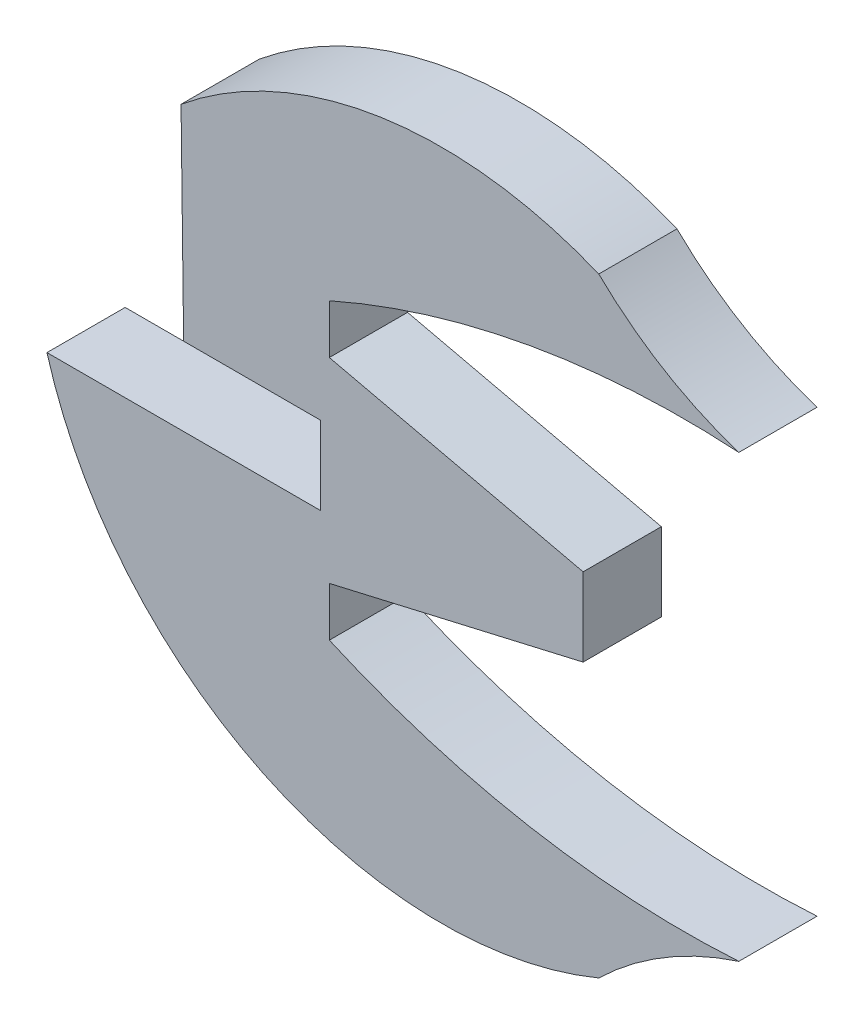
ISO-10303-21;
HEADER;
FILE_DESCRIPTION(('STEP AP214'),'2;1');
FILE_NAME('part.step','',(''),(''),'','','');
FILE_SCHEMA(('AUTOMOTIVE_DESIGN { 1 0 10303 214 1 1 1 1 }'));
ENDSEC;
DATA;
#1=APPLICATION_CONTEXT('core data for automotive mechanical design processes');
#2=APPLICATION_PROTOCOL_DEFINITION('international standard','automotive_design',2000,#1);
#3=PRODUCT_CONTEXT('',#1,'mechanical');
#4=PRODUCT('Part','Part','',(#3));
#5=PRODUCT_RELATED_PRODUCT_CATEGORY('part','',(#4));
#6=PRODUCT_DEFINITION_FORMATION('','',#4);
#7=PRODUCT_DEFINITION_CONTEXT('part definition',#1,'design');
#8=PRODUCT_DEFINITION('design','',#6,#7);
#9=PRODUCT_DEFINITION_SHAPE('','',#8);
#10=(LENGTH_UNIT() NAMED_UNIT(*) SI_UNIT(.MILLI.,.METRE.));
#11=(NAMED_UNIT(*) PLANE_ANGLE_UNIT() SI_UNIT($,.RADIAN.));
#12=(NAMED_UNIT(*) SI_UNIT($,.STERADIAN.) SOLID_ANGLE_UNIT());
#13=UNCERTAINTY_MEASURE_WITH_UNIT(LENGTH_MEASURE(1.E-05),#10,'distance_accuracy_value','');
#14=(GEOMETRIC_REPRESENTATION_CONTEXT(3) GLOBAL_UNCERTAINTY_ASSIGNED_CONTEXT((#13)) GLOBAL_UNIT_ASSIGNED_CONTEXT((#10,
#11,#12)) REPRESENTATION_CONTEXT('',''));
#15=CARTESIAN_POINT('',(0.,0.,0.));
#16=DIRECTION('',(0.,0.,1.));
#17=DIRECTION('',(1.,0.,0.));
#18=AXIS2_PLACEMENT_3D('',#15,#16,#17);
#19=CARTESIAN_POINT('',(41.6848102395139,0.,1.524));
#20=DIRECTION('',(0.,1.,0.));
#21=DIRECTION('',(-1.,0.,0.));
#22=AXIS2_PLACEMENT_3D('',#19,#20,#21);
#23=PLANE('',#22);
#24=DIRECTION('',(1.,0.,0.));
#25=VECTOR('',#24,1.);
#26=CARTESIAN_POINT('',(41.6848102395139,0.,0.));
#27=LINE('',#26,#25);
#28=CARTESIAN_POINT('',(39.0213897386134,0.,0.));
#29=VERTEX_POINT('',#28);
#30=CARTESIAN_POINT('',(41.6848102395139,0.,0.));
#31=VERTEX_POINT('',#30);
#32=EDGE_CURVE('E169',#29,#31,#27,.T.);
#33=ORIENTED_EDGE('',*,*,#32,.T.);
#34=DIRECTION('',(0.,0.,-1.));
#35=VECTOR('',#34,1.);
#36=CARTESIAN_POINT('',(41.6848102395139,0.,1.524));
#37=LINE('',#36,#35);
#38=CARTESIAN_POINT('',(41.6848102395139,0.,1.524));
#39=VERTEX_POINT('',#38);
#40=EDGE_CURVE('E11',#39,#31,#37,.T.);
#41=ORIENTED_EDGE('',*,*,#40,.F.);
#42=DIRECTION('',(1.,0.,0.));
#43=VECTOR('',#42,1.);
#44=CARTESIAN_POINT('',(41.6848102395139,0.,1.524));
#45=LINE('',#44,#43);
#46=CARTESIAN_POINT('',(39.0213897386134,0.,1.524));
#47=VERTEX_POINT('',#46);
#48=EDGE_CURVE('E197',#47,#39,#45,.T.);
#49=ORIENTED_EDGE('',*,*,#48,.F.);
#50=DIRECTION('',(0.,0.,-1.));
#51=VECTOR('',#50,1.);
#52=CARTESIAN_POINT('',(39.0213897386134,0.,1.524));
#53=LINE('',#52,#51);
#54=EDGE_CURVE('E165',#47,#29,#53,.T.);
#55=ORIENTED_EDGE('',*,*,#54,.T.);
#56=EDGE_LOOP('',(#33,#41,#49,#55));
#57=FACE_BOUND('',#56,.T.);
#58=ADVANCED_FACE('F31',(#57),#23,.F.);
#59=CARTESIAN_POINT('',(41.6848102395139,0.,1.524));
#60=DIRECTION('',(1.,0.,0.));
#61=DIRECTION('',(0.,0.,-1.));
#62=AXIS2_PLACEMENT_3D('',#59,#60,#61);
#63=PLANE('',#62);
#64=DIRECTION('',(0.,-1.,0.));
#65=VECTOR('',#64,1.);
#66=CARTESIAN_POINT('',(41.6848102395139,0.,0.));
#67=LINE('',#66,#65);
#68=CARTESIAN_POINT('',(41.6848102395139,-1.524,0.));
#69=VERTEX_POINT('',#68);
#70=EDGE_CURVE('E172',#31,#69,#67,.T.);
#71=ORIENTED_EDGE('',*,*,#70,.T.);
#72=DIRECTION('',(0.,0.,-1.));
#73=VECTOR('',#72,1.);
#74=CARTESIAN_POINT('',(41.6848102395139,-1.524,1.524));
#75=LINE('',#74,#73);
#76=CARTESIAN_POINT('',(41.6848102395139,-1.524,1.524));
#77=VERTEX_POINT('',#76);
#78=EDGE_CURVE('E39',#77,#69,#75,.T.);
#79=ORIENTED_EDGE('',*,*,#78,.F.);
#80=DIRECTION('',(0.,-1.,0.));
#81=VECTOR('',#80,1.);
#82=CARTESIAN_POINT('',(41.6848102395139,0.,1.524));
#83=LINE('',#82,#81);
#84=EDGE_CURVE('E111',#39,#77,#83,.T.);
#85=ORIENTED_EDGE('',*,*,#84,.F.);
#86=ORIENTED_EDGE('',*,*,#40,.T.);
#87=EDGE_LOOP('',(#71,#79,#85,#86));
#88=FACE_BOUND('',#87,.T.);
#89=ADVANCED_FACE('F290',(#88),#63,.F.);
#90=CARTESIAN_POINT('',(41.6848102395139,-1.524,1.524));
#91=DIRECTION('',(0.,-1.,0.));
#92=DIRECTION('',(0.,0.,-1.));
#93=AXIS2_PLACEMENT_3D('',#90,#91,#92);
#94=PLANE('',#93);
#95=DIRECTION('',(-1.,0.,0.));
#96=VECTOR('',#95,1.);
#97=CARTESIAN_POINT('',(41.6848102395139,-1.524,0.));
#98=LINE('',#97,#96);
#99=CARTESIAN_POINT('',(36.357969237713,-1.524,0.));
#100=VERTEX_POINT('',#99);
#101=EDGE_CURVE('E174',#69,#100,#98,.T.);
#102=ORIENTED_EDGE('',*,*,#101,.T.);
#103=DIRECTION('',(0.,0.,-1.));
#104=VECTOR('',#103,1.);
#105=CARTESIAN_POINT('',(36.357969237713,-1.524,1.524));
#106=LINE('',#105,#104);
#107=CARTESIAN_POINT('',(36.357969237713,-1.524,1.524));
#108=VERTEX_POINT('',#107);
#109=EDGE_CURVE('E225',#108,#100,#106,.T.);
#110=ORIENTED_EDGE('',*,*,#109,.F.);
#111=DIRECTION('',(-1.,0.,0.));
#112=VECTOR('',#111,1.);
#113=CARTESIAN_POINT('',(41.6848102395139,-1.524,1.524));
#114=LINE('',#113,#112);
#115=EDGE_CURVE('E233',#77,#108,#114,.T.);
#116=ORIENTED_EDGE('',*,*,#115,.F.);
#117=ORIENTED_EDGE('',*,*,#78,.T.);
#118=EDGE_LOOP('',(#102,#110,#116,#117));
#119=FACE_BOUND('',#118,.T.);
#120=ADVANCED_FACE('F231',(#119),#94,.F.);
#121=CARTESIAN_POINT('',(44.0460277671729,0.686810719156323,1.524));
#122=DIRECTION('',(0.,0.,-1.));
#123=DIRECTION('',(-1.,0.,0.));
#124=AXIS2_PLACEMENT_3D('',#121,#122,#123);
#125=CYLINDRICAL_SURFACE('',#124,7.99962049026944);
#126=CARTESIAN_POINT('',(44.0460277671729,0.686810719156323,0.));
#127=DIRECTION('',(0.,0.,1.));
#128=DIRECTION('',(-1.,0.,0.));
#129=AXIS2_PLACEMENT_3D('',#126,#127,#128);
#130=CIRCLE('',#129,7.99962049026944);
#131=CARTESIAN_POINT('',(47.1111058802478,-6.70231806230959,0.));
#132=VERTEX_POINT('',#131);
#133=EDGE_CURVE('E176',#100,#132,#130,.T.);
#134=ORIENTED_EDGE('',*,*,#133,.T.);
#135=DIRECTION('',(0.,0.,-1.));
#136=VECTOR('',#135,1.);
#137=CARTESIAN_POINT('',(47.1111058802478,-6.70231806230959,1.524));
#138=LINE('',#137,#136);
#139=CARTESIAN_POINT('',(47.1111058802478,-6.70231806230959,1.524));
#140=VERTEX_POINT('',#139);
#141=EDGE_CURVE('E222',#140,#132,#138,.T.);
#142=ORIENTED_EDGE('',*,*,#141,.F.);
#143=CARTESIAN_POINT('',(44.0460277671729,0.686810719156323,1.524));
#144=DIRECTION('',(0.,0.,1.));
#145=DIRECTION('',(-1.,0.,0.));
#146=AXIS2_PLACEMENT_3D('',#143,#144,#145);
#147=CIRCLE('',#146,7.99962049026944);
#148=EDGE_CURVE('E251',#108,#140,#147,.T.);
#149=ORIENTED_EDGE('',*,*,#148,.F.);
#150=ORIENTED_EDGE('',*,*,#109,.T.);
#151=EDGE_LOOP('',(#134,#142,#149,#150));
#152=FACE_BOUND('',#151,.T.);
#153=ADVANCED_FACE('F242',(#152),#125,.T.);
#154=CARTESIAN_POINT('',(52.0028808130916,-11.7290532733377,1.524));
#155=DIRECTION('',(0.,0.,-1.));
#156=DIRECTION('',(-1.,0.,0.));
#157=AXIS2_PLACEMENT_3D('',#154,#155,#156);
#158=CYLINDRICAL_SURFACE('',#157,7.01409501471067);
#159=CARTESIAN_POINT('',(52.0028808130916,-11.7290532733377,0.));
#160=DIRECTION('',(0.,0.,-1.));
#161=DIRECTION('',(1.,0.,0.));
#162=AXIS2_PLACEMENT_3D('',#159,#160,#161);
#163=CIRCLE('',#162,7.01409501471067);
#164=CARTESIAN_POINT('',(49.8407366045512,-5.05652292144987,0.));
#165=VERTEX_POINT('',#164);
#166=EDGE_CURVE('E178',#132,#165,#163,.T.);
#167=ORIENTED_EDGE('',*,*,#166,.T.);
#168=DIRECTION('',(0.,0.,-1.));
#169=VECTOR('',#168,1.);
#170=CARTESIAN_POINT('',(49.8407366045512,-5.05652292144987,1.524));
#171=LINE('',#170,#169);
#172=CARTESIAN_POINT('',(49.8407366045512,-5.05652292144987,1.524));
#173=VERTEX_POINT('',#172);
#174=EDGE_CURVE('E219',#173,#165,#171,.T.);
#175=ORIENTED_EDGE('',*,*,#174,.F.);
#176=CARTESIAN_POINT('',(52.0028808130916,-11.7290532733377,1.524));
#177=DIRECTION('',(0.,0.,-1.));
#178=DIRECTION('',(1.,0.,0.));
#179=AXIS2_PLACEMENT_3D('',#176,#177,#178);
#180=CIRCLE('',#179,7.01409501471067);
#181=EDGE_CURVE('E248',#140,#173,#180,.T.);
#182=ORIENTED_EDGE('',*,*,#181,.F.);
#183=ORIENTED_EDGE('',*,*,#141,.T.);
#184=EDGE_LOOP('',(#167,#175,#182,#183));
#185=FACE_BOUND('',#184,.T.);
#186=ADVANCED_FACE('F246',(#185),#158,.F.);
#187=CARTESIAN_POINT('',(48.7734680539811,11.9651102828948,1.524));
#188=DIRECTION('',(0.,0.,-1.));
#189=DIRECTION('',(-1.,0.,0.));
#190=AXIS2_PLACEMENT_3D('',#187,#188,#189);
#191=CYLINDRICAL_SURFACE('',#190,17.0550596335012);
#192=CARTESIAN_POINT('',(48.7734680539811,11.9651102828948,0.));
#193=DIRECTION('',(0.,0.,-1.));
#194=DIRECTION('',(1.,0.,0.));
#195=AXIS2_PLACEMENT_3D('',#192,#193,#194);
#196=CIRCLE('',#195,17.0550596335012);
#197=CARTESIAN_POINT('',(41.8607593922502,-3.62621801396031,0.));
#198=VERTEX_POINT('',#197);
#199=EDGE_CURVE('E180',#165,#198,#196,.T.);
#200=ORIENTED_EDGE('',*,*,#199,.T.);
#201=DIRECTION('',(0.,0.,-1.));
#202=VECTOR('',#201,1.);
#203=CARTESIAN_POINT('',(41.8607593922502,-3.62621801396031,1.524));
#204=LINE('',#203,#202);
#205=CARTESIAN_POINT('',(41.8607593922502,-3.62621801396031,1.524));
#206=VERTEX_POINT('',#205);
#207=EDGE_CURVE('E216',#206,#198,#204,.T.);
#208=ORIENTED_EDGE('',*,*,#207,.F.);
#209=CARTESIAN_POINT('',(48.7734680539811,11.9651102828948,1.524));
#210=DIRECTION('',(0.,0.,-1.));
#211=DIRECTION('',(1.,0.,0.));
#212=AXIS2_PLACEMENT_3D('',#209,#210,#211);
#213=CIRCLE('',#212,17.0550596335012);
#214=EDGE_CURVE('E250',#173,#206,#213,.T.);
#215=ORIENTED_EDGE('',*,*,#214,.F.);
#216=ORIENTED_EDGE('',*,*,#174,.T.);
#217=EDGE_LOOP('',(#200,#208,#215,#216));
#218=FACE_BOUND('',#217,.T.);
#219=ADVANCED_FACE('F303',(#218),#191,.F.);
#220=CARTESIAN_POINT('',(41.8607593922502,-2.6675803220968,1.524));
#221=DIRECTION('',(-1.,0.,0.));
#222=DIRECTION('',(0.,0.,1.));
#223=AXIS2_PLACEMENT_3D('',#220,#221,#222);
#224=PLANE('',#223);
#225=DIRECTION('',(0.,1.,0.));
#226=VECTOR('',#225,1.);
#227=CARTESIAN_POINT('',(41.8607593922502,-2.6675803220968,0.));
#228=LINE('',#227,#226);
#229=CARTESIAN_POINT('',(41.8607593922502,-2.6675803220968,0.));
#230=VERTEX_POINT('',#229);
#231=EDGE_CURVE('E182',#198,#230,#228,.T.);
#232=ORIENTED_EDGE('',*,*,#231,.T.);
#233=DIRECTION('',(0.,0.,-1.));
#234=VECTOR('',#233,1.);
#235=CARTESIAN_POINT('',(41.8607593922502,-2.6675803220968,1.524));
#236=LINE('',#235,#234);
#237=CARTESIAN_POINT('',(41.8607593922502,-2.6675803220968,1.524));
#238=VERTEX_POINT('',#237);
#239=EDGE_CURVE('E213',#238,#230,#236,.T.);
#240=ORIENTED_EDGE('',*,*,#239,.F.);
#241=DIRECTION('',(0.,1.,0.));
#242=VECTOR('',#241,1.);
#243=CARTESIAN_POINT('',(41.8607593922502,-2.6675803220968,1.524));
#244=LINE('',#243,#242);
#245=EDGE_CURVE('E253',#206,#238,#244,.T.);
#246=ORIENTED_EDGE('',*,*,#245,.F.);
#247=ORIENTED_EDGE('',*,*,#207,.T.);
#248=EDGE_LOOP('',(#232,#240,#246,#247));
#249=FACE_BOUND('',#248,.T.);
#250=ADVANCED_FACE('F306',(#249),#224,.F.);
#251=CARTESIAN_POINT('',(41.8607593922502,-2.6675803220968,1.524));
#252=DIRECTION('',(-0.225294774762645,0.974290646811643,0.));
#253=DIRECTION('',(-0.974290646811643,-0.225294774762645,0.));
#254=AXIS2_PLACEMENT_3D('',#251,#252,#253);
#255=PLANE('',#254);
#256=DIRECTION('',(0.974290646811643,0.225294774762645,0.));
#257=VECTOR('',#256,1.);
#258=CARTESIAN_POINT('',(41.8607593922502,-2.6675803220968,0.));
#259=LINE('',#258,#257);
#260=CARTESIAN_POINT('',(46.806189719565,-1.524,0.));
#261=VERTEX_POINT('',#260);
#262=EDGE_CURVE('E184',#230,#261,#259,.T.);
#263=ORIENTED_EDGE('',*,*,#262,.T.);
#264=DIRECTION('',(0.,0.,-1.));
#265=VECTOR('',#264,1.);
#266=CARTESIAN_POINT('',(46.806189719565,-1.524,1.524));
#267=LINE('',#266,#265);
#268=CARTESIAN_POINT('',(46.806189719565,-1.524,1.524));
#269=VERTEX_POINT('',#268);
#270=EDGE_CURVE('E210',#269,#261,#267,.T.);
#271=ORIENTED_EDGE('',*,*,#270,.F.);
#272=DIRECTION('',(0.974290646811643,0.225294774762645,0.));
#273=VECTOR('',#272,1.);
#274=CARTESIAN_POINT('',(41.8607593922502,-2.6675803220968,1.524));
#275=LINE('',#274,#273);
#276=EDGE_CURVE('E259',#238,#269,#275,.T.);
#277=ORIENTED_EDGE('',*,*,#276,.F.);
#278=ORIENTED_EDGE('',*,*,#239,.T.);
#279=EDGE_LOOP('',(#263,#271,#277,#278));
#280=FACE_BOUND('',#279,.T.);
#281=ADVANCED_FACE('F310',(#280),#255,.F.);
#282=CARTESIAN_POINT('',(46.806189719565,-1.524,1.524));
#283=DIRECTION('',(-1.,0.,0.));
#284=DIRECTION('',(0.,0.,1.));
#285=AXIS2_PLACEMENT_3D('',#282,#283,#284);
#286=PLANE('',#285);
#287=DIRECTION('',(0.,1.,0.));
#288=VECTOR('',#287,1.);
#289=CARTESIAN_POINT('',(46.806189719565,-1.524,0.));
#290=LINE('',#289,#288);
#291=CARTESIAN_POINT('',(46.806189719565,0.,0.));
#292=VERTEX_POINT('',#291);
#293=EDGE_CURVE('E186',#261,#292,#290,.T.);
#294=ORIENTED_EDGE('',*,*,#293,.T.);
#295=DIRECTION('',(0.,0.,-1.));
#296=VECTOR('',#295,1.);
#297=CARTESIAN_POINT('',(46.806189719565,0.,1.524));
#298=LINE('',#297,#296);
#299=CARTESIAN_POINT('',(46.806189719565,0.,1.524));
#300=VERTEX_POINT('',#299);
#301=EDGE_CURVE('E207',#300,#292,#298,.T.);
#302=ORIENTED_EDGE('',*,*,#301,.F.);
#303=DIRECTION('',(0.,1.,0.));
#304=VECTOR('',#303,1.);
#305=CARTESIAN_POINT('',(46.806189719565,-1.524,1.524));
#306=LINE('',#305,#304);
#307=EDGE_CURVE('E261',#269,#300,#306,.T.);
#308=ORIENTED_EDGE('',*,*,#307,.F.);
#309=ORIENTED_EDGE('',*,*,#270,.T.);
#310=EDGE_LOOP('',(#294,#302,#308,#309));
#311=FACE_BOUND('',#310,.T.);
#312=ADVANCED_FACE('F314',(#311),#286,.F.);
#313=CARTESIAN_POINT('',(41.8607593922502,1.14358032209679,1.524));
#314=DIRECTION('',(-0.225294774762645,-0.974290646811643,0.));
#315=DIRECTION('',(0.974290646811643,-0.225294774762645,0.));
#316=AXIS2_PLACEMENT_3D('',#313,#314,#315);
#317=PLANE('',#316);
#318=DIRECTION('',(-0.974290646811643,0.225294774762645,0.));
#319=VECTOR('',#318,1.);
#320=CARTESIAN_POINT('',(41.8607593922502,1.14358032209679,0.));
#321=LINE('',#320,#319);
#322=CARTESIAN_POINT('',(41.8607593922502,1.14358032209679,0.));
#323=VERTEX_POINT('',#322);
#324=EDGE_CURVE('E188',#292,#323,#321,.T.);
#325=ORIENTED_EDGE('',*,*,#324,.T.);
#326=DIRECTION('',(0.,0.,-1.));
#327=VECTOR('',#326,1.);
#328=CARTESIAN_POINT('',(41.8607593922502,1.14358032209679,1.524));
#329=LINE('',#328,#327);
#330=CARTESIAN_POINT('',(41.8607593922502,1.14358032209679,1.524));
#331=VERTEX_POINT('',#330);
#332=EDGE_CURVE('E204',#331,#323,#329,.T.);
#333=ORIENTED_EDGE('',*,*,#332,.F.);
#334=DIRECTION('',(-0.974290646811643,0.225294774762645,0.));
#335=VECTOR('',#334,1.);
#336=CARTESIAN_POINT('',(41.8607593922502,1.14358032209679,1.524));
#337=LINE('',#336,#335);
#338=EDGE_CURVE('E263',#300,#331,#337,.T.);
#339=ORIENTED_EDGE('',*,*,#338,.F.);
#340=ORIENTED_EDGE('',*,*,#301,.T.);
#341=EDGE_LOOP('',(#325,#333,#339,#340));
#342=FACE_BOUND('',#341,.T.);
#343=ADVANCED_FACE('F318',(#342),#317,.F.);
#344=CARTESIAN_POINT('',(41.8607593922502,1.14358032209679,1.524));
#345=DIRECTION('',(-1.,0.,0.));
#346=DIRECTION('',(0.,0.,1.));
#347=AXIS2_PLACEMENT_3D('',#344,#345,#346);
#348=PLANE('',#347);
#349=DIRECTION('',(0.,1.,0.));
#350=VECTOR('',#349,1.);
#351=CARTESIAN_POINT('',(41.8607593922502,1.14358032209679,0.));
#352=LINE('',#351,#350);
#353=CARTESIAN_POINT('',(41.8607593922502,2.1022180139603,0.));
#354=VERTEX_POINT('',#353);
#355=EDGE_CURVE('E190',#323,#354,#352,.T.);
#356=ORIENTED_EDGE('',*,*,#355,.T.);
#357=DIRECTION('',(0.,0.,-1.));
#358=VECTOR('',#357,1.);
#359=CARTESIAN_POINT('',(41.8607593922502,2.1022180139603,1.524));
#360=LINE('',#359,#358);
#361=CARTESIAN_POINT('',(41.8607593922502,2.1022180139603,1.524));
#362=VERTEX_POINT('',#361);
#363=EDGE_CURVE('E201',#362,#354,#360,.T.);
#364=ORIENTED_EDGE('',*,*,#363,.F.);
#365=DIRECTION('',(0.,1.,0.));
#366=VECTOR('',#365,1.);
#367=CARTESIAN_POINT('',(41.8607593922502,1.14358032209679,1.524));
#368=LINE('',#367,#366);
#369=EDGE_CURVE('E265',#331,#362,#368,.T.);
#370=ORIENTED_EDGE('',*,*,#369,.F.);
#371=ORIENTED_EDGE('',*,*,#332,.T.);
#372=EDGE_LOOP('',(#356,#364,#370,#371));
#373=FACE_BOUND('',#372,.T.);
#374=ADVANCED_FACE('F271',(#373),#348,.F.);
#375=CARTESIAN_POINT('',(48.7734680539811,-13.4891102828948,1.524));
#376=DIRECTION('',(0.,0.,-1.));
#377=DIRECTION('',(-1.,0.,0.));
#378=AXIS2_PLACEMENT_3D('',#375,#376,#377);
#379=CYLINDRICAL_SURFACE('',#378,17.0550596335012);
#380=CARTESIAN_POINT('',(48.7734680539811,-13.4891102828948,0.));
#381=DIRECTION('',(0.,0.,-1.));
#382=DIRECTION('',(-1.,0.,0.));
#383=AXIS2_PLACEMENT_3D('',#380,#381,#382);
#384=CIRCLE('',#383,17.0550596335012);
#385=CARTESIAN_POINT('',(49.8407366045512,3.53252292144986,0.));
#386=VERTEX_POINT('',#385);
#387=EDGE_CURVE('E192',#354,#386,#384,.T.);
#388=ORIENTED_EDGE('',*,*,#387,.T.);
#389=DIRECTION('',(0.,0.,-1.));
#390=VECTOR('',#389,1.);
#391=CARTESIAN_POINT('',(49.8407366045512,3.53252292144986,1.524));
#392=LINE('',#391,#390);
#393=CARTESIAN_POINT('',(49.8407366045512,3.53252292144986,1.524));
#394=VERTEX_POINT('',#393);
#395=EDGE_CURVE('E160',#394,#386,#392,.T.);
#396=ORIENTED_EDGE('',*,*,#395,.F.);
#397=CARTESIAN_POINT('',(48.7734680539811,-13.4891102828948,1.524));
#398=DIRECTION('',(0.,0.,-1.));
#399=DIRECTION('',(-1.,0.,0.));
#400=AXIS2_PLACEMENT_3D('',#397,#398,#399);
#401=CIRCLE('',#400,17.0550596335012);
#402=EDGE_CURVE('E151',#362,#394,#401,.T.);
#403=ORIENTED_EDGE('',*,*,#402,.F.);
#404=ORIENTED_EDGE('',*,*,#363,.T.);
#405=EDGE_LOOP('',(#388,#396,#403,#404));
#406=FACE_BOUND('',#405,.T.);
#407=ADVANCED_FACE('F275',(#406),#379,.F.);
#408=CARTESIAN_POINT('',(52.0028808130916,10.2050532733377,1.524));
#409=DIRECTION('',(0.,0.,-1.));
#410=DIRECTION('',(-1.,0.,0.));
#411=AXIS2_PLACEMENT_3D('',#408,#409,#410);
#412=CYLINDRICAL_SURFACE('',#411,7.01409501471067);
#413=CARTESIAN_POINT('',(52.0028808130916,10.2050532733377,0.));
#414=DIRECTION('',(0.,0.,-1.));
#415=DIRECTION('',(-1.,0.,0.));
#416=AXIS2_PLACEMENT_3D('',#413,#414,#415);
#417=CIRCLE('',#416,7.01409501471067);
#418=CARTESIAN_POINT('',(47.1111058802478,5.17831806230958,0.));
#419=VERTEX_POINT('',#418);
#420=EDGE_CURVE('E159',#386,#419,#417,.T.);
#421=ORIENTED_EDGE('',*,*,#420,.T.);
#422=DIRECTION('',(0.,0.,-1.));
#423=VECTOR('',#422,1.);
#424=CARTESIAN_POINT('',(47.1111058802478,5.17831806230958,1.524));
#425=LINE('',#424,#423);
#426=CARTESIAN_POINT('',(47.1111058802478,5.17831806230958,1.524));
#427=VERTEX_POINT('',#426);
#428=EDGE_CURVE('E156',#427,#419,#425,.T.);
#429=ORIENTED_EDGE('',*,*,#428,.F.);
#430=CARTESIAN_POINT('',(52.0028808130916,10.2050532733377,1.524));
#431=DIRECTION('',(0.,0.,-1.));
#432=DIRECTION('',(-1.,0.,0.));
#433=AXIS2_PLACEMENT_3D('',#430,#431,#432);
#434=CIRCLE('',#433,7.01409501471067);
#435=EDGE_CURVE('E145',#394,#427,#434,.T.);
#436=ORIENTED_EDGE('',*,*,#435,.F.);
#437=ORIENTED_EDGE('',*,*,#395,.T.);
#438=EDGE_LOOP('',(#421,#429,#436,#437));
#439=FACE_BOUND('',#438,.T.);
#440=ADVANCED_FACE('F157',(#439),#412,.F.);
#441=CARTESIAN_POINT('',(44.0460277671729,-2.21081071915633,1.524));
#442=DIRECTION('',(0.,0.,-1.));
#443=DIRECTION('',(-1.,0.,0.));
#444=AXIS2_PLACEMENT_3D('',#441,#442,#443);
#445=CYLINDRICAL_SURFACE('',#444,7.99962049026944);
#446=CARTESIAN_POINT('',(44.0460277671729,-2.21081071915633,0.));
#447=DIRECTION('',(0.,0.,1.));
#448=DIRECTION('',(1.,0.,0.));
#449=AXIS2_PLACEMENT_3D('',#446,#447,#448);
#450=CIRCLE('',#449,7.99962049026944);
#451=CARTESIAN_POINT('',(38.9710853298873,3.97294924114096,0.));
#452=VERTEX_POINT('',#451);
#453=EDGE_CURVE('E97',#419,#452,#450,.T.);
#454=ORIENTED_EDGE('',*,*,#453,.T.);
#455=DIRECTION('',(0.,0.,-1.));
#456=VECTOR('',#455,1.);
#457=CARTESIAN_POINT('',(38.9710853298873,3.97294924114096,1.524));
#458=LINE('',#457,#456);
#459=CARTESIAN_POINT('',(38.9710853298873,3.97294924114096,1.524));
#460=VERTEX_POINT('',#459);
#461=EDGE_CURVE('E161',#460,#452,#458,.T.);
#462=ORIENTED_EDGE('',*,*,#461,.F.);
#463=CARTESIAN_POINT('',(44.0460277671729,-2.21081071915633,1.524));
#464=DIRECTION('',(0.,0.,1.));
#465=DIRECTION('',(1.,0.,0.));
#466=AXIS2_PLACEMENT_3D('',#463,#464,#465);
#467=CIRCLE('',#466,7.99962049026944);
#468=EDGE_CURVE('E149',#427,#460,#467,.T.);
#469=ORIENTED_EDGE('',*,*,#468,.F.);
#470=ORIENTED_EDGE('',*,*,#428,.T.);
#471=EDGE_LOOP('',(#454,#462,#469,#470));
#472=FACE_BOUND('',#471,.T.);
#473=ADVANCED_FACE('F163',(#472),#445,.T.);
#474=CARTESIAN_POINT('',(38.9710853298873,3.97294924114096,1.524));
#475=DIRECTION('',(0.999919849939738,0.0126607146912156,0.));
#476=DIRECTION('',(-0.0126607146912156,0.999919849939738,0.));
#477=AXIS2_PLACEMENT_3D('',#474,#475,#476);
#478=PLANE('',#477);
#479=DIRECTION('',(0.0126607146912156,-0.999919849939738,0.));
#480=VECTOR('',#479,1.);
#481=CARTESIAN_POINT('',(38.9710853298873,3.97294924114096,0.));
#482=LINE('',#481,#480);
#483=EDGE_CURVE('E103',#452,#29,#482,.T.);
#484=ORIENTED_EDGE('',*,*,#483,.T.);
#485=ORIENTED_EDGE('',*,*,#54,.F.);
#486=DIRECTION('',(0.0126607146912156,-0.999919849939738,0.));
#487=VECTOR('',#486,1.);
#488=CARTESIAN_POINT('',(38.9710853298873,3.97294924114096,1.524));
#489=LINE('',#488,#487);
#490=EDGE_CURVE('E47',#460,#47,#489,.T.);
#491=ORIENTED_EDGE('',*,*,#490,.F.);
#492=ORIENTED_EDGE('',*,*,#461,.T.);
#493=EDGE_LOOP('',(#484,#485,#491,#492));
#494=FACE_BOUND('',#493,.T.);
#495=ADVANCED_FACE('F279',(#494),#478,.F.);
#496=CARTESIAN_POINT('',(44.0460277671729,-2.21081071915633,1.524));
#497=DIRECTION('',(0.,0.,1.));
#498=DIRECTION('',(1.,0.,0.));
#499=AXIS2_PLACEMENT_3D('',#496,#497,#498);
#500=PLANE('',#499);
#501=ORIENTED_EDGE('',*,*,#48,.T.);
#502=ORIENTED_EDGE('',*,*,#84,.T.);
#503=ORIENTED_EDGE('',*,*,#115,.T.);
#504=ORIENTED_EDGE('',*,*,#148,.T.);
#505=ORIENTED_EDGE('',*,*,#181,.T.);
#506=ORIENTED_EDGE('',*,*,#214,.T.);
#507=ORIENTED_EDGE('',*,*,#245,.T.);
#508=ORIENTED_EDGE('',*,*,#276,.T.);
#509=ORIENTED_EDGE('',*,*,#307,.T.);
#510=ORIENTED_EDGE('',*,*,#338,.T.);
#511=ORIENTED_EDGE('',*,*,#369,.T.);
#512=ORIENTED_EDGE('',*,*,#402,.T.);
#513=ORIENTED_EDGE('',*,*,#435,.T.);
#514=ORIENTED_EDGE('',*,*,#468,.T.);
#515=ORIENTED_EDGE('',*,*,#490,.T.);
#516=EDGE_LOOP('',(#501,#502,#503,#504,#505,#506,#507,#508,#509,#510,#511,#512,#513,#514,#515));
#517=FACE_BOUND('',#516,.T.);
#518=ADVANCED_FACE('F147',(#517),#500,.T.);
#519=CARTESIAN_POINT('',(44.0460277671729,-2.21081071915633,0.));
#520=DIRECTION('',(0.,0.,1.));
#521=DIRECTION('',(1.,0.,0.));
#522=AXIS2_PLACEMENT_3D('',#519,#520,#521);
#523=PLANE('',#522);
#524=ORIENTED_EDGE('',*,*,#32,.F.);
#525=ORIENTED_EDGE('',*,*,#483,.F.);
#526=ORIENTED_EDGE('',*,*,#453,.F.);
#527=ORIENTED_EDGE('',*,*,#420,.F.);
#528=ORIENTED_EDGE('',*,*,#387,.F.);
#529=ORIENTED_EDGE('',*,*,#355,.F.);
#530=ORIENTED_EDGE('',*,*,#324,.F.);
#531=ORIENTED_EDGE('',*,*,#293,.F.);
#532=ORIENTED_EDGE('',*,*,#262,.F.);
#533=ORIENTED_EDGE('',*,*,#231,.F.);
#534=ORIENTED_EDGE('',*,*,#199,.F.);
#535=ORIENTED_EDGE('',*,*,#166,.F.);
#536=ORIENTED_EDGE('',*,*,#133,.F.);
#537=ORIENTED_EDGE('',*,*,#101,.F.);
#538=ORIENTED_EDGE('',*,*,#70,.F.);
#539=EDGE_LOOP('',(#524,#525,#526,#527,#528,#529,#530,#531,#532,#533,#534,#535,#536,#537,#538));
#540=FACE_BOUND('',#539,.T.);
#541=ADVANCED_FACE('F237',(#540),#523,.F.);
#542=CLOSED_SHELL('',(#58,#89,#120,#153,#186,#219,#250,#281,#312,#343,#374,#407,#440,#473,#495,
#518,#541));
#543=MANIFOLD_SOLID_BREP('B2',#542);
#544=ADVANCED_BREP_SHAPE_REPRESENTATION('',(#18,#543),#14);
#545=SHAPE_DEFINITION_REPRESENTATION(#9,#544);
ENDSEC;
END-ISO-10303-21;
